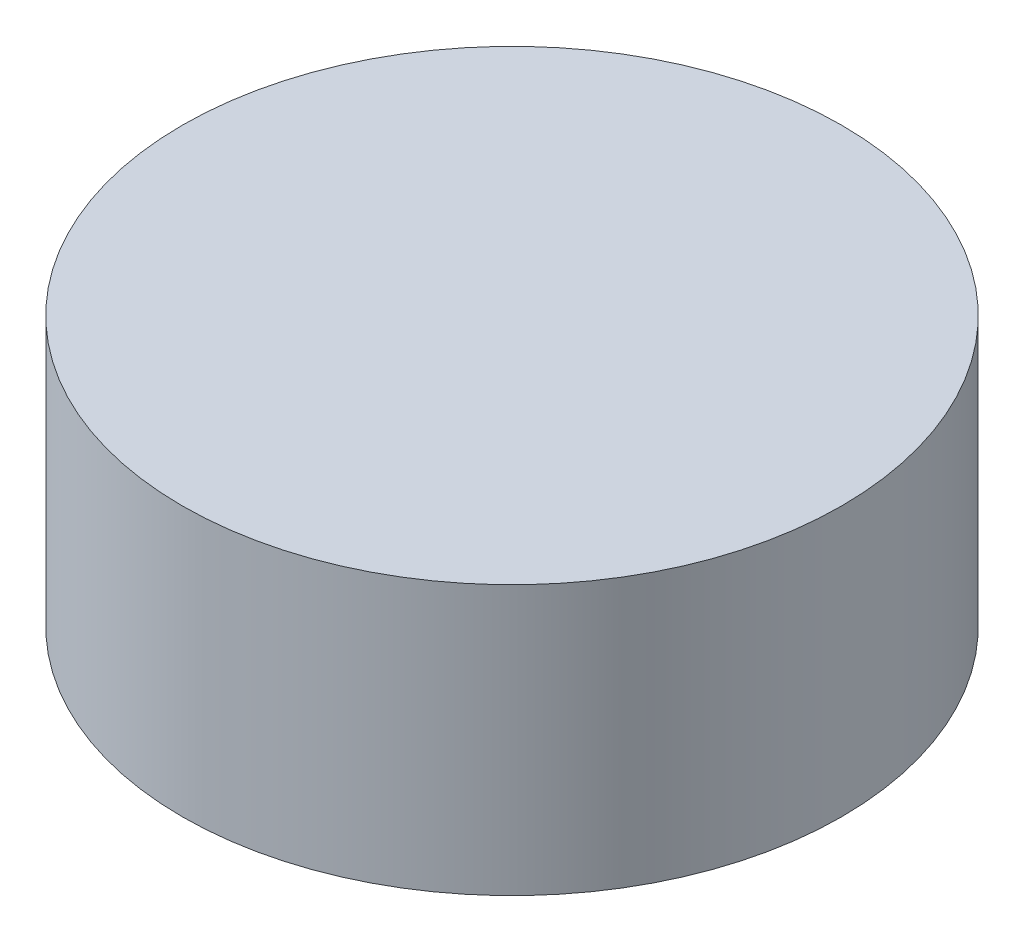
ISO-10303-21;
HEADER;
FILE_DESCRIPTION(('STEP AP214'),'2;1');
FILE_NAME('part.step','',(''),(''),'','','');
FILE_SCHEMA(('AUTOMOTIVE_DESIGN { 1 0 10303 214 1 1 1 1 }'));
ENDSEC;
DATA;
#1=APPLICATION_CONTEXT('core data for automotive mechanical design processes');
#2=APPLICATION_PROTOCOL_DEFINITION('international standard','automotive_design',2000,#1);
#3=PRODUCT_CONTEXT('',#1,'mechanical');
#4=PRODUCT('Part','Part','',(#3));
#5=PRODUCT_RELATED_PRODUCT_CATEGORY('part','',(#4));
#6=PRODUCT_DEFINITION_FORMATION('','',#4);
#7=PRODUCT_DEFINITION_CONTEXT('part definition',#1,'design');
#8=PRODUCT_DEFINITION('design','',#6,#7);
#9=PRODUCT_DEFINITION_SHAPE('','',#8);
#10=(LENGTH_UNIT() NAMED_UNIT(*) SI_UNIT(.MILLI.,.METRE.));
#11=(NAMED_UNIT(*) PLANE_ANGLE_UNIT() SI_UNIT($,.RADIAN.));
#12=(NAMED_UNIT(*) SI_UNIT($,.STERADIAN.) SOLID_ANGLE_UNIT());
#13=UNCERTAINTY_MEASURE_WITH_UNIT(LENGTH_MEASURE(1.E-05),#10,'distance_accuracy_value','');
#14=(GEOMETRIC_REPRESENTATION_CONTEXT(3) GLOBAL_UNCERTAINTY_ASSIGNED_CONTEXT((#13)) GLOBAL_UNIT_ASSIGNED_CONTEXT((#10,
#11,#12)) REPRESENTATION_CONTEXT('',''));
#15=CARTESIAN_POINT('',(0.,0.,0.));
#16=DIRECTION('',(0.,0.,1.));
#17=DIRECTION('',(1.,0.,0.));
#18=AXIS2_PLACEMENT_3D('',#15,#16,#17);
#19=CARTESIAN_POINT('',(0.,2.45,0.));
#20=DIRECTION('',(0.,-1.,0.));
#21=DIRECTION('',(0.,0.,-1.));
#22=AXIS2_PLACEMENT_3D('',#19,#20,#21);
#23=CYLINDRICAL_SURFACE('',#22,3.);
#24=CARTESIAN_POINT('',(0.,2.45,0.));
#25=DIRECTION('',(0.,1.,0.));
#26=DIRECTION('',(0.,0.,1.));
#27=AXIS2_PLACEMENT_3D('',#24,#25,#26);
#28=CIRCLE('',#27,3.);
#29=CARTESIAN_POINT('',(0.,2.45,3.));
#30=VERTEX_POINT('',#29);
#31=EDGE_CURVE('E10',#30,#30,#28,.T.);
#32=ORIENTED_EDGE('',*,*,#31,.F.);
#33=EDGE_LOOP('',(#32));
#34=FACE_BOUND('',#33,.T.);
#35=CARTESIAN_POINT('',(0.,0.,0.));
#36=DIRECTION('',(0.,1.,0.));
#37=DIRECTION('',(0.,0.,1.));
#38=AXIS2_PLACEMENT_3D('',#35,#36,#37);
#39=CIRCLE('',#38,3.);
#40=CARTESIAN_POINT('',(0.,0.,3.));
#41=VERTEX_POINT('',#40);
#42=EDGE_CURVE('E35',#41,#41,#39,.T.);
#43=ORIENTED_EDGE('',*,*,#42,.T.);
#44=EDGE_LOOP('',(#43));
#45=FACE_BOUND('',#44,.T.);
#46=ADVANCED_FACE('F32',(#34,#45),#23,.T.);
#47=CARTESIAN_POINT('',(0.,2.45,0.));
#48=DIRECTION('',(0.,1.,0.));
#49=DIRECTION('',(0.,0.,1.));
#50=AXIS2_PLACEMENT_3D('',#47,#48,#49);
#51=PLANE('',#50);
#52=ORIENTED_EDGE('',*,*,#31,.T.);
#53=EDGE_LOOP('',(#52));
#54=FACE_BOUND('',#53,.T.);
#55=ADVANCED_FACE('F47',(#54),#51,.T.);
#56=CARTESIAN_POINT('',(0.,0.,0.));
#57=DIRECTION('',(0.,1.,0.));
#58=DIRECTION('',(0.,0.,1.));
#59=AXIS2_PLACEMENT_3D('',#56,#57,#58);
#60=PLANE('',#59);
#61=ORIENTED_EDGE('',*,*,#42,.F.);
#62=EDGE_LOOP('',(#61));
#63=FACE_BOUND('',#62,.T.);
#64=ADVANCED_FACE('F45',(#63),#60,.F.);
#65=CLOSED_SHELL('',(#46,#55,#64));
#66=MANIFOLD_SOLID_BREP('B2',#65);
#67=ADVANCED_BREP_SHAPE_REPRESENTATION('',(#18,#66),#14);
#68=SHAPE_DEFINITION_REPRESENTATION(#9,#67);
ENDSEC;
END-ISO-10303-21;
